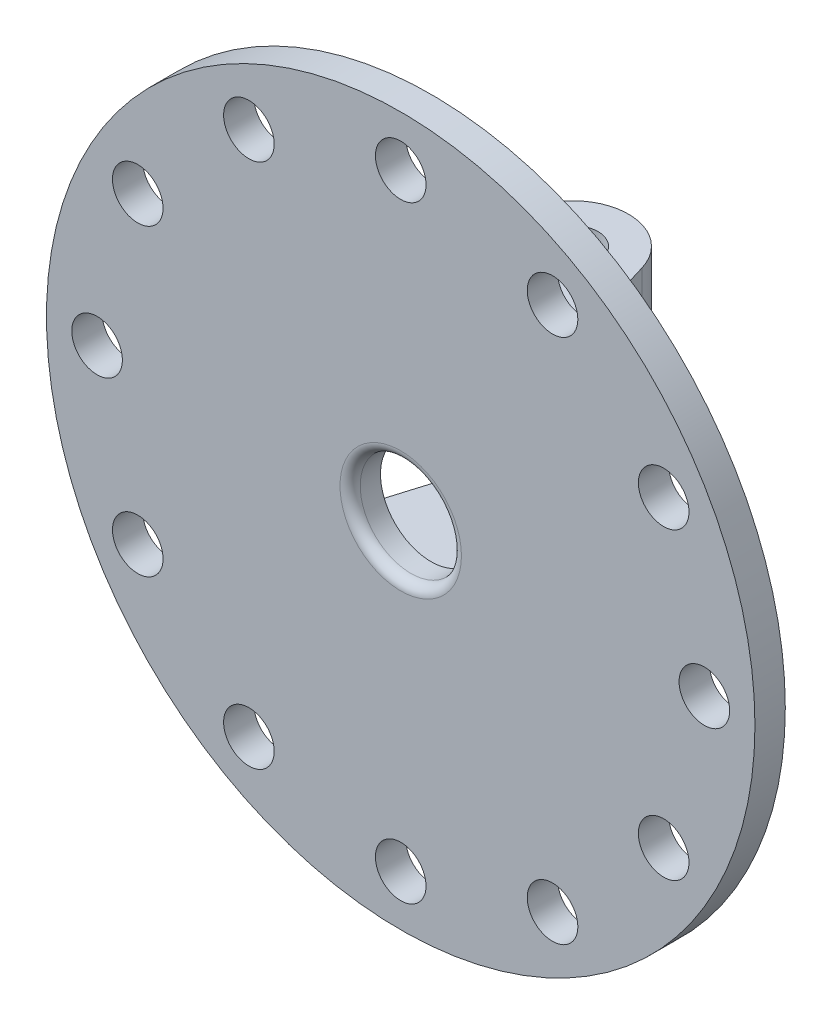
ISO-10303-21;
HEADER;
FILE_DESCRIPTION(('STEP AP214'),'2;1');
FILE_NAME('part.step','',(''),(''),'','','');
FILE_SCHEMA(('AUTOMOTIVE_DESIGN { 1 0 10303 214 1 1 1 1 }'));
ENDSEC;
DATA;
#1=APPLICATION_CONTEXT('core data for automotive mechanical design processes');
#2=APPLICATION_PROTOCOL_DEFINITION('international standard','automotive_design',2000,#1);
#3=PRODUCT_CONTEXT('',#1,'mechanical');
#4=PRODUCT('Part','Part','',(#3));
#5=PRODUCT_RELATED_PRODUCT_CATEGORY('part','',(#4));
#6=PRODUCT_DEFINITION_FORMATION('','',#4);
#7=PRODUCT_DEFINITION_CONTEXT('part definition',#1,'design');
#8=PRODUCT_DEFINITION('design','',#6,#7);
#9=PRODUCT_DEFINITION_SHAPE('','',#8);
#10=(LENGTH_UNIT() NAMED_UNIT(*) SI_UNIT(.MILLI.,.METRE.));
#11=(NAMED_UNIT(*) PLANE_ANGLE_UNIT() SI_UNIT($,.RADIAN.));
#12=(NAMED_UNIT(*) SI_UNIT($,.STERADIAN.) SOLID_ANGLE_UNIT());
#13=UNCERTAINTY_MEASURE_WITH_UNIT(LENGTH_MEASURE(1.E-05),#10,'distance_accuracy_value','');
#14=(GEOMETRIC_REPRESENTATION_CONTEXT(3) GLOBAL_UNCERTAINTY_ASSIGNED_CONTEXT((#13)) GLOBAL_UNIT_ASSIGNED_CONTEXT((#10,
#11,#12)) REPRESENTATION_CONTEXT('',''));
#15=CARTESIAN_POINT('',(0.,0.,0.));
#16=DIRECTION('',(0.,0.,1.));
#17=DIRECTION('',(1.,0.,0.));
#18=AXIS2_PLACEMENT_3D('',#15,#16,#17);
#19=CARTESIAN_POINT('',(-10.,15.,0.));
#20=DIRECTION('',(0.95684380208316,0.,0.290602715773686));
#21=DIRECTION('',(0.290602715773686,0.,-0.95684380208316));
#22=AXIS2_PLACEMENT_3D('',#19,#20,#21);
#23=PLANE('',#22);
#24=DIRECTION('',(0.,-1.,0.));
#25=VECTOR('',#24,1.);
#26=CARTESIAN_POINT('',(-10.,15.,0.));
#27=LINE('',#26,#25);
#28=CARTESIAN_POINT('',(-10.,-6.,0.));
#29=VERTEX_POINT('',#28);
#30=CARTESIAN_POINT('',(-10.,-15.,0.));
#31=VERTEX_POINT('',#30);
#32=EDGE_CURVE('E238',#29,#31,#27,.T.);
#33=ORIENTED_EDGE('',*,*,#32,.F.);
#34=DIRECTION('',(0.290602715773686,0.,-0.95684380208316));
#35=VECTOR('',#34,1.);
#36=CARTESIAN_POINT('',(-10.,-6.,0.));
#37=LINE('',#36,#35);
#38=CARTESIAN_POINT('',(-5.26264091145738,-6.,-15.5983149367553));
#39=VERTEX_POINT('',#38);
#40=EDGE_CURVE('E217',#29,#39,#37,.T.);
#41=ORIENTED_EDGE('',*,*,#40,.T.);
#42=DIRECTION('',(0.,-1.,0.));
#43=VECTOR('',#42,1.);
#44=CARTESIAN_POINT('',(-5.26264091145738,15.,-15.5983149367553));
#45=LINE('',#44,#43);
#46=CARTESIAN_POINT('',(-5.26264091145738,-15.,-15.5983149367553));
#47=VERTEX_POINT('',#46);
#48=EDGE_CURVE('E242',#39,#47,#45,.T.);
#49=ORIENTED_EDGE('',*,*,#48,.T.);
#50=DIRECTION('',(-0.290602715773686,0.,0.95684380208316));
#51=VECTOR('',#50,1.);
#52=CARTESIAN_POINT('',(-10.,-15.,0.));
#53=LINE('',#52,#51);
#54=EDGE_CURVE('E239',#47,#31,#53,.T.);
#55=ORIENTED_EDGE('',*,*,#54,.T.);
#56=EDGE_LOOP('',(#33,#41,#49,#55));
#57=FACE_BOUND('',#56,.T.);
#58=ADVANCED_FACE('F33',(#57),#23,.F.);
#59=CARTESIAN_POINT('',(10.,15.,0.));
#60=DIRECTION('',(-0.95684380208316,0.,0.290602715773686));
#61=DIRECTION('',(0.290602715773686,0.,0.95684380208316));
#62=AXIS2_PLACEMENT_3D('',#59,#60,#61);
#63=PLANE('',#62);
#64=DIRECTION('',(0.,-1.,0.));
#65=VECTOR('',#64,1.);
#66=CARTESIAN_POINT('',(5.26264091145739,15.,-15.5983149367553));
#67=LINE('',#66,#65);
#68=CARTESIAN_POINT('',(5.26264091145739,-6.,-15.5983149367553));
#69=VERTEX_POINT('',#68);
#70=CARTESIAN_POINT('',(5.26264091145739,-15.,-15.5983149367553));
#71=VERTEX_POINT('',#70);
#72=EDGE_CURVE('E228',#69,#71,#67,.T.);
#73=ORIENTED_EDGE('',*,*,#72,.F.);
#74=DIRECTION('',(0.290602715773686,0.,0.95684380208316));
#75=VECTOR('',#74,1.);
#76=CARTESIAN_POINT('',(10.,-6.,0.));
#77=LINE('',#76,#75);
#78=CARTESIAN_POINT('',(10.,-6.,0.));
#79=VERTEX_POINT('',#78);
#80=EDGE_CURVE('E237',#69,#79,#77,.T.);
#81=ORIENTED_EDGE('',*,*,#80,.T.);
#82=DIRECTION('',(0.,-1.,0.));
#83=VECTOR('',#82,1.);
#84=CARTESIAN_POINT('',(10.,15.,0.));
#85=LINE('',#84,#83);
#86=CARTESIAN_POINT('',(10.,-15.,0.));
#87=VERTEX_POINT('',#86);
#88=EDGE_CURVE('E233',#79,#87,#85,.T.);
#89=ORIENTED_EDGE('',*,*,#88,.T.);
#90=DIRECTION('',(-0.290602715773686,0.,-0.95684380208316));
#91=VECTOR('',#90,1.);
#92=CARTESIAN_POINT('',(10.,-15.,0.));
#93=LINE('',#92,#91);
#94=EDGE_CURVE('E229',#87,#71,#93,.T.);
#95=ORIENTED_EDGE('',*,*,#94,.T.);
#96=EDGE_LOOP('',(#73,#81,#89,#95));
#97=FACE_BOUND('',#96,.T.);
#98=ADVANCED_FACE('F273',(#97),#63,.F.);
#99=CARTESIAN_POINT('',(0.,15.,-14.));
#100=DIRECTION('',(0.,-1.,0.));
#101=DIRECTION('',(0.,0.,-1.));
#102=AXIS2_PLACEMENT_3D('',#99,#100,#101);
#103=CYLINDRICAL_SURFACE('',#102,5.5);
#104=ORIENTED_EDGE('',*,*,#48,.F.);
#105=CARTESIAN_POINT('',(0.,-6.,-14.));
#106=DIRECTION('',(0.,-1.,0.));
#107=DIRECTION('',(0.,0.,-1.));
#108=AXIS2_PLACEMENT_3D('',#105,#106,#107);
#109=CIRCLE('',#108,5.5);
#110=EDGE_CURVE('E232',#39,#69,#109,.T.);
#111=ORIENTED_EDGE('',*,*,#110,.T.);
#112=ORIENTED_EDGE('',*,*,#72,.T.);
#113=CARTESIAN_POINT('',(0.,-15.,-14.));
#114=DIRECTION('',(0.,1.,0.));
#115=DIRECTION('',(0.,0.,1.));
#116=AXIS2_PLACEMENT_3D('',#113,#114,#115);
#117=CIRCLE('',#116,5.5);
#118=EDGE_CURVE('E225',#71,#47,#117,.T.);
#119=ORIENTED_EDGE('',*,*,#118,.T.);
#120=EDGE_LOOP('',(#104,#111,#112,#119));
#121=FACE_BOUND('',#120,.T.);
#122=ADVANCED_FACE('F279',(#121),#103,.T.);
#123=CARTESIAN_POINT('',(0.,15.,-14.));
#124=DIRECTION('',(0.,-1.,0.));
#125=DIRECTION('',(0.,0.,-1.));
#126=AXIS2_PLACEMENT_3D('',#123,#124,#125);
#127=CYLINDRICAL_SURFACE('',#126,2.5);
#128=CARTESIAN_POINT('',(0.,-6.,-14.));
#129=DIRECTION('',(0.,-1.,0.));
#130=DIRECTION('',(0.,0.,-1.));
#131=AXIS2_PLACEMENT_3D('',#128,#129,#130);
#132=CIRCLE('',#131,2.5);
#133=CARTESIAN_POINT('',(0.,-6.,-16.5));
#134=VERTEX_POINT('',#133);
#135=EDGE_CURVE('E220',#134,#134,#132,.T.);
#136=ORIENTED_EDGE('',*,*,#135,.F.);
#137=EDGE_LOOP('',(#136));
#138=FACE_BOUND('',#137,.T.);
#139=CARTESIAN_POINT('',(0.,-15.,-14.));
#140=DIRECTION('',(0.,1.,0.));
#141=DIRECTION('',(0.,0.,1.));
#142=AXIS2_PLACEMENT_3D('',#139,#140,#141);
#143=CIRCLE('',#142,2.5);
#144=CARTESIAN_POINT('',(0.,-15.,-11.5));
#145=VERTEX_POINT('',#144);
#146=EDGE_CURVE('E224',#145,#145,#143,.T.);
#147=ORIENTED_EDGE('',*,*,#146,.F.);
#148=EDGE_LOOP('',(#147));
#149=FACE_BOUND('',#148,.T.);
#150=ADVANCED_FACE('F284',(#138,#149),#127,.F.);
#151=CARTESIAN_POINT('',(0.,-15.,-14.));
#152=DIRECTION('',(0.,1.,0.));
#153=DIRECTION('',(0.,0.,1.));
#154=AXIS2_PLACEMENT_3D('',#151,#152,#153);
#155=PLANE('',#154);
#156=ORIENTED_EDGE('',*,*,#54,.F.);
#157=ORIENTED_EDGE('',*,*,#118,.F.);
#158=ORIENTED_EDGE('',*,*,#94,.F.);
#159=DIRECTION('',(1.,0.,0.));
#160=VECTOR('',#159,1.);
#161=CARTESIAN_POINT('',(-10.,-15.,0.));
#162=LINE('',#161,#160);
#163=EDGE_CURVE('E234',#31,#87,#162,.T.);
#164=ORIENTED_EDGE('',*,*,#163,.F.);
#165=EDGE_LOOP('',(#156,#157,#158,#164));
#166=FACE_BOUND('',#165,.T.);
#167=ORIENTED_EDGE('',*,*,#146,.T.);
#168=EDGE_LOOP('',(#167));
#169=FACE_BOUND('',#168,.T.);
#170=ADVANCED_FACE('F286',(#166,#169),#155,.F.);
#171=CARTESIAN_POINT('',(-15.,-6.,0.));
#172=DIRECTION('',(0.,-1.,0.));
#173=DIRECTION('',(0.,0.,-1.));
#174=AXIS2_PLACEMENT_3D('',#171,#172,#173);
#175=PLANE('',#174);
#176=ORIENTED_EDGE('',*,*,#135,.T.);
#177=EDGE_LOOP('',(#176));
#178=FACE_BOUND('',#177,.T.);
#179=DIRECTION('',(1.,0.,0.));
#180=VECTOR('',#179,1.);
#181=CARTESIAN_POINT('',(-15.,-6.,0.));
#182=LINE('',#181,#180);
#183=EDGE_CURVE('E223',#29,#79,#182,.T.);
#184=ORIENTED_EDGE('',*,*,#183,.T.);
#185=ORIENTED_EDGE('',*,*,#80,.F.);
#186=ORIENTED_EDGE('',*,*,#110,.F.);
#187=ORIENTED_EDGE('',*,*,#40,.F.);
#188=EDGE_LOOP('',(#184,#185,#186,#187));
#189=FACE_BOUND('',#188,.T.);
#190=ADVANCED_FACE('F292',(#178,#189),#175,.F.);
#191=CARTESIAN_POINT('',(0.,0.,3.));
#192=DIRECTION('',(0.,0.,1.));
#193=DIRECTION('',(1.,0.,0.));
#194=AXIS2_PLACEMENT_3D('',#191,#192,#193);
#195=PLANE('',#194);
#196=CARTESIAN_POINT('',(0.,0.,3.));
#197=DIRECTION('',(0.,0.,1.));
#198=DIRECTION('',(1.,0.,0.));
#199=AXIS2_PLACEMENT_3D('',#196,#197,#198);
#200=CIRCLE('',#199,6.);
#201=CARTESIAN_POINT('',(6.,0.,3.));
#202=VERTEX_POINT('',#201);
#203=EDGE_CURVE('E11',#202,#202,#200,.F.);
#204=ORIENTED_EDGE('',*,*,#203,.T.);
#205=EDGE_LOOP('',(#204));
#206=FACE_BOUND('',#205,.T.);
#207=CARTESIAN_POINT('',(-25.9807621135338,15.000000000002,3.));
#208=DIRECTION('',(0.,0.,1.));
#209=DIRECTION('',(1.,0.,0.));
#210=AXIS2_PLACEMENT_3D('',#207,#208,#209);
#211=CIRCLE('',#210,2.5);
#212=CARTESIAN_POINT('',(-23.4807621135338,15.000000000002,3.));
#213=VERTEX_POINT('',#212);
#214=EDGE_CURVE('E145',#213,#213,#211,.T.);
#215=ORIENTED_EDGE('',*,*,#214,.F.);
#216=EDGE_LOOP('',(#215));
#217=FACE_BOUND('',#216,.T.);
#218=CARTESIAN_POINT('',(-25.9807621135332,-15.0000000000001,3.));
#219=DIRECTION('',(0.,0.,1.));
#220=DIRECTION('',(1.,0.,0.));
#221=AXIS2_PLACEMENT_3D('',#218,#219,#220);
#222=CIRCLE('',#221,2.5);
#223=CARTESIAN_POINT('',(-23.4807621135332,-15.0000000000001,3.));
#224=VERTEX_POINT('',#223);
#225=EDGE_CURVE('E157',#224,#224,#222,.T.);
#226=ORIENTED_EDGE('',*,*,#225,.F.);
#227=EDGE_LOOP('',(#226));
#228=FACE_BOUND('',#227,.T.);
#229=CARTESIAN_POINT('',(0.,-30.0000000000001,3.));
#230=DIRECTION('',(0.,0.,1.));
#231=DIRECTION('',(1.,0.,0.));
#232=AXIS2_PLACEMENT_3D('',#229,#230,#231);
#233=CIRCLE('',#232,2.5);
#234=CARTESIAN_POINT('',(2.49999999999997,-30.0000000000001,3.));
#235=VERTEX_POINT('',#234);
#236=EDGE_CURVE('E169',#235,#235,#233,.T.);
#237=ORIENTED_EDGE('',*,*,#236,.F.);
#238=EDGE_LOOP('',(#237));
#239=FACE_BOUND('',#238,.T.);
#240=CARTESIAN_POINT('',(25.9807621135332,-15.0000000000001,3.));
#241=DIRECTION('',(0.,0.,1.));
#242=DIRECTION('',(1.,0.,0.));
#243=AXIS2_PLACEMENT_3D('',#240,#241,#242);
#244=CIRCLE('',#243,2.5);
#245=CARTESIAN_POINT('',(28.4807621135332,-15.0000000000001,3.));
#246=VERTEX_POINT('',#245);
#247=EDGE_CURVE('E181',#246,#246,#244,.T.);
#248=ORIENTED_EDGE('',*,*,#247,.F.);
#249=EDGE_LOOP('',(#248));
#250=FACE_BOUND('',#249,.T.);
#251=CARTESIAN_POINT('',(25.9807621135317,14.9999999999984,3.));
#252=DIRECTION('',(0.,0.,1.));
#253=DIRECTION('',(1.,0.,0.));
#254=AXIS2_PLACEMENT_3D('',#251,#252,#253);
#255=CIRCLE('',#254,2.5);
#256=CARTESIAN_POINT('',(28.4807621135317,14.9999999999984,3.));
#257=VERTEX_POINT('',#256);
#258=EDGE_CURVE('E193',#257,#257,#255,.T.);
#259=ORIENTED_EDGE('',*,*,#258,.F.);
#260=EDGE_LOOP('',(#259));
#261=FACE_BOUND('',#260,.T.);
#262=CARTESIAN_POINT('',(0.,30.,3.));
#263=DIRECTION('',(0.,0.,1.));
#264=DIRECTION('',(1.,0.,0.));
#265=AXIS2_PLACEMENT_3D('',#262,#263,#264);
#266=CIRCLE('',#265,2.5);
#267=CARTESIAN_POINT('',(2.5,30.,3.));
#268=VERTEX_POINT('',#267);
#269=EDGE_CURVE('E205',#268,#268,#266,.T.);
#270=ORIENTED_EDGE('',*,*,#269,.F.);
#271=EDGE_LOOP('',(#270));
#272=FACE_BOUND('',#271,.T.);
#273=CARTESIAN_POINT('',(0.,0.,3.));
#274=DIRECTION('',(0.,0.,1.));
#275=DIRECTION('',(1.,0.,0.));
#276=AXIS2_PLACEMENT_3D('',#273,#274,#275);
#277=CIRCLE('',#276,35.);
#278=CARTESIAN_POINT('',(35.,0.,3.));
#279=VERTEX_POINT('',#278);
#280=EDGE_CURVE('E214',#279,#279,#277,.T.);
#281=ORIENTED_EDGE('',*,*,#280,.T.);
#282=EDGE_LOOP('',(#281));
#283=FACE_BOUND('',#282,.T.);
#284=CARTESIAN_POINT('',(15.,25.9807621135331,3.));
#285=DIRECTION('',(0.,0.,1.));
#286=DIRECTION('',(1.,0.,0.));
#287=AXIS2_PLACEMENT_3D('',#284,#285,#286);
#288=CIRCLE('',#287,2.5);
#289=CARTESIAN_POINT('',(17.5,25.9807621135331,3.));
#290=VERTEX_POINT('',#289);
#291=EDGE_CURVE('E199',#290,#290,#288,.T.);
#292=ORIENTED_EDGE('',*,*,#291,.F.);
#293=EDGE_LOOP('',(#292));
#294=FACE_BOUND('',#293,.T.);
#295=CARTESIAN_POINT('',(30.,0.,3.));
#296=DIRECTION('',(0.,0.,1.));
#297=DIRECTION('',(1.,0.,0.));
#298=AXIS2_PLACEMENT_3D('',#295,#296,#297);
#299=CIRCLE('',#298,2.5);
#300=CARTESIAN_POINT('',(32.5,0.,3.));
#301=VERTEX_POINT('',#300);
#302=EDGE_CURVE('E187',#301,#301,#299,.T.);
#303=ORIENTED_EDGE('',*,*,#302,.F.);
#304=EDGE_LOOP('',(#303));
#305=FACE_BOUND('',#304,.T.);
#306=CARTESIAN_POINT('',(15.,-25.9807621135333,3.));
#307=DIRECTION('',(0.,0.,1.));
#308=DIRECTION('',(1.,0.,0.));
#309=AXIS2_PLACEMENT_3D('',#306,#307,#308);
#310=CIRCLE('',#309,2.5);
#311=CARTESIAN_POINT('',(17.5,-25.9807621135333,3.));
#312=VERTEX_POINT('',#311);
#313=EDGE_CURVE('E175',#312,#312,#310,.T.);
#314=ORIENTED_EDGE('',*,*,#313,.F.);
#315=EDGE_LOOP('',(#314));
#316=FACE_BOUND('',#315,.T.);
#317=CARTESIAN_POINT('',(-15.0000000000001,-25.9807621135333,3.));
#318=DIRECTION('',(0.,0.,1.));
#319=DIRECTION('',(1.,0.,0.));
#320=AXIS2_PLACEMENT_3D('',#317,#318,#319);
#321=CIRCLE('',#320,2.5);
#322=CARTESIAN_POINT('',(-12.5000000000001,-25.9807621135333,3.));
#323=VERTEX_POINT('',#322);
#324=EDGE_CURVE('E163',#323,#323,#321,.T.);
#325=ORIENTED_EDGE('',*,*,#324,.F.);
#326=EDGE_LOOP('',(#325));
#327=FACE_BOUND('',#326,.T.);
#328=CARTESIAN_POINT('',(-30.0000000000001,0.,3.));
#329=DIRECTION('',(0.,0.,1.));
#330=DIRECTION('',(1.,0.,0.));
#331=AXIS2_PLACEMENT_3D('',#328,#329,#330);
#332=CIRCLE('',#331,2.5);
#333=CARTESIAN_POINT('',(-27.5000000000001,0.,3.));
#334=VERTEX_POINT('',#333);
#335=EDGE_CURVE('E151',#334,#334,#332,.T.);
#336=ORIENTED_EDGE('',*,*,#335,.F.);
#337=EDGE_LOOP('',(#336));
#338=FACE_BOUND('',#337,.T.);
#339=CARTESIAN_POINT('',(-15.,25.9807621135332,3.));
#340=DIRECTION('',(0.,0.,1.));
#341=DIRECTION('',(1.,0.,0.));
#342=AXIS2_PLACEMENT_3D('',#339,#340,#341);
#343=CIRCLE('',#342,2.5);
#344=CARTESIAN_POINT('',(-12.5,25.9807621135332,3.));
#345=VERTEX_POINT('',#344);
#346=EDGE_CURVE('E139',#345,#345,#343,.T.);
#347=ORIENTED_EDGE('',*,*,#346,.F.);
#348=EDGE_LOOP('',(#347));
#349=FACE_BOUND('',#348,.T.);
#350=ADVANCED_FACE('F303',(#206,#217,#228,#239,#250,#261,#272,#283,#294,#305,#316,#327,#338,
#349),#195,.T.);
#351=CARTESIAN_POINT('',(0.,0.,0.));
#352=DIRECTION('',(0.,0.,1.));
#353=DIRECTION('',(1.,0.,0.));
#354=AXIS2_PLACEMENT_3D('',#351,#352,#353);
#355=PLANE('',#354);
#356=DIRECTION('',(0.,-1.,0.));
#357=VECTOR('',#356,1.);
#358=CARTESIAN_POINT('',(10.,15.,0.));
#359=LINE('',#358,#357);
#360=CARTESIAN_POINT('',(10.,15.,0.));
#361=VERTEX_POINT('',#360);
#362=CARTESIAN_POINT('',(10.,6.,0.));
#363=VERTEX_POINT('',#362);
#364=EDGE_CURVE('E48',#361,#363,#359,.T.);
#365=ORIENTED_EDGE('',*,*,#364,.F.);
#366=DIRECTION('',(1.,0.,0.));
#367=VECTOR('',#366,1.);
#368=CARTESIAN_POINT('',(-10.,15.,0.));
#369=LINE('',#368,#367);
#370=CARTESIAN_POINT('',(-10.,15.,0.));
#371=VERTEX_POINT('',#370);
#372=EDGE_CURVE('E52',#371,#361,#369,.T.);
#373=ORIENTED_EDGE('',*,*,#372,.F.);
#374=DIRECTION('',(0.,-1.,0.));
#375=VECTOR('',#374,1.);
#376=CARTESIAN_POINT('',(-10.,15.,0.));
#377=LINE('',#376,#375);
#378=CARTESIAN_POINT('',(-10.,6.,0.));
#379=VERTEX_POINT('',#378);
#380=EDGE_CURVE('E94',#371,#379,#377,.T.);
#381=ORIENTED_EDGE('',*,*,#380,.T.);
#382=DIRECTION('',(1.,0.,0.));
#383=VECTOR('',#382,1.);
#384=CARTESIAN_POINT('',(-15.,6.,0.));
#385=LINE('',#384,#383);
#386=EDGE_CURVE('E98',#379,#363,#385,.T.);
#387=ORIENTED_EDGE('',*,*,#386,.T.);
#388=EDGE_LOOP('',(#365,#373,#381,#387));
#389=FACE_BOUND('',#388,.T.);
#390=ORIENTED_EDGE('',*,*,#88,.F.);
#391=ORIENTED_EDGE('',*,*,#183,.F.);
#392=ORIENTED_EDGE('',*,*,#32,.T.);
#393=ORIENTED_EDGE('',*,*,#163,.T.);
#394=EDGE_LOOP('',(#390,#391,#392,#393));
#395=FACE_BOUND('',#394,.T.);
#396=CARTESIAN_POINT('',(0.,0.,0.));
#397=DIRECTION('',(0.,0.,1.));
#398=DIRECTION('',(1.,0.,0.));
#399=AXIS2_PLACEMENT_3D('',#396,#397,#398);
#400=CIRCLE('',#399,35.);
#401=CARTESIAN_POINT('',(35.,0.,0.));
#402=VERTEX_POINT('',#401);
#403=EDGE_CURVE('E213',#402,#402,#400,.T.);
#404=ORIENTED_EDGE('',*,*,#403,.F.);
#405=EDGE_LOOP('',(#404));
#406=FACE_BOUND('',#405,.T.);
#407=CARTESIAN_POINT('',(0.,0.,0.));
#408=DIRECTION('',(0.,0.,1.));
#409=DIRECTION('',(1.,0.,0.));
#410=AXIS2_PLACEMENT_3D('',#407,#408,#409);
#411=CIRCLE('',#410,5.);
#412=CARTESIAN_POINT('',(5.,0.,0.));
#413=VERTEX_POINT('',#412);
#414=EDGE_CURVE('E208',#413,#413,#411,.T.);
#415=ORIENTED_EDGE('',*,*,#414,.T.);
#416=EDGE_LOOP('',(#415));
#417=FACE_BOUND('',#416,.T.);
#418=CARTESIAN_POINT('',(0.,30.,0.));
#419=DIRECTION('',(0.,0.,1.));
#420=DIRECTION('',(1.,0.,0.));
#421=AXIS2_PLACEMENT_3D('',#418,#419,#420);
#422=CIRCLE('',#421,2.5);
#423=CARTESIAN_POINT('',(2.5,30.,0.));
#424=VERTEX_POINT('',#423);
#425=EDGE_CURVE('E202',#424,#424,#422,.T.);
#426=ORIENTED_EDGE('',*,*,#425,.T.);
#427=EDGE_LOOP('',(#426));
#428=FACE_BOUND('',#427,.T.);
#429=CARTESIAN_POINT('',(15.,25.9807621135331,0.));
#430=DIRECTION('',(0.,0.,1.));
#431=DIRECTION('',(1.,0.,0.));
#432=AXIS2_PLACEMENT_3D('',#429,#430,#431);
#433=CIRCLE('',#432,2.5);
#434=CARTESIAN_POINT('',(17.5,25.9807621135331,0.));
#435=VERTEX_POINT('',#434);
#436=EDGE_CURVE('E196',#435,#435,#433,.T.);
#437=ORIENTED_EDGE('',*,*,#436,.T.);
#438=EDGE_LOOP('',(#437));
#439=FACE_BOUND('',#438,.T.);
#440=CARTESIAN_POINT('',(25.9807621135317,14.9999999999984,0.));
#441=DIRECTION('',(0.,0.,1.));
#442=DIRECTION('',(1.,0.,0.));
#443=AXIS2_PLACEMENT_3D('',#440,#441,#442);
#444=CIRCLE('',#443,2.5);
#445=CARTESIAN_POINT('',(28.4807621135317,14.9999999999984,0.));
#446=VERTEX_POINT('',#445);
#447=EDGE_CURVE('E190',#446,#446,#444,.T.);
#448=ORIENTED_EDGE('',*,*,#447,.T.);
#449=EDGE_LOOP('',(#448));
#450=FACE_BOUND('',#449,.T.);
#451=CARTESIAN_POINT('',(30.,0.,0.));
#452=DIRECTION('',(0.,0.,1.));
#453=DIRECTION('',(1.,0.,0.));
#454=AXIS2_PLACEMENT_3D('',#451,#452,#453);
#455=CIRCLE('',#454,2.5);
#456=CARTESIAN_POINT('',(32.5,0.,0.));
#457=VERTEX_POINT('',#456);
#458=EDGE_CURVE('E184',#457,#457,#455,.T.);
#459=ORIENTED_EDGE('',*,*,#458,.T.);
#460=EDGE_LOOP('',(#459));
#461=FACE_BOUND('',#460,.T.);
#462=CARTESIAN_POINT('',(25.9807621135332,-15.0000000000001,0.));
#463=DIRECTION('',(0.,0.,1.));
#464=DIRECTION('',(1.,0.,0.));
#465=AXIS2_PLACEMENT_3D('',#462,#463,#464);
#466=CIRCLE('',#465,2.5);
#467=CARTESIAN_POINT('',(28.4807621135332,-15.0000000000001,0.));
#468=VERTEX_POINT('',#467);
#469=EDGE_CURVE('E178',#468,#468,#466,.T.);
#470=ORIENTED_EDGE('',*,*,#469,.T.);
#471=EDGE_LOOP('',(#470));
#472=FACE_BOUND('',#471,.T.);
#473=CARTESIAN_POINT('',(15.,-25.9807621135333,0.));
#474=DIRECTION('',(0.,0.,1.));
#475=DIRECTION('',(1.,0.,0.));
#476=AXIS2_PLACEMENT_3D('',#473,#474,#475);
#477=CIRCLE('',#476,2.5);
#478=CARTESIAN_POINT('',(17.5,-25.9807621135333,0.));
#479=VERTEX_POINT('',#478);
#480=EDGE_CURVE('E172',#479,#479,#477,.T.);
#481=ORIENTED_EDGE('',*,*,#480,.T.);
#482=EDGE_LOOP('',(#481));
#483=FACE_BOUND('',#482,.T.);
#484=CARTESIAN_POINT('',(0.,-30.0000000000001,0.));
#485=DIRECTION('',(0.,0.,1.));
#486=DIRECTION('',(1.,0.,0.));
#487=AXIS2_PLACEMENT_3D('',#484,#485,#486);
#488=CIRCLE('',#487,2.5);
#489=CARTESIAN_POINT('',(2.49999999999997,-30.0000000000001,0.));
#490=VERTEX_POINT('',#489);
#491=EDGE_CURVE('E166',#490,#490,#488,.T.);
#492=ORIENTED_EDGE('',*,*,#491,.T.);
#493=EDGE_LOOP('',(#492));
#494=FACE_BOUND('',#493,.T.);
#495=CARTESIAN_POINT('',(-15.0000000000001,-25.9807621135333,0.));
#496=DIRECTION('',(0.,0.,1.));
#497=DIRECTION('',(1.,0.,0.));
#498=AXIS2_PLACEMENT_3D('',#495,#496,#497);
#499=CIRCLE('',#498,2.5);
#500=CARTESIAN_POINT('',(-12.5000000000001,-25.9807621135333,0.));
#501=VERTEX_POINT('',#500);
#502=EDGE_CURVE('E160',#501,#501,#499,.T.);
#503=ORIENTED_EDGE('',*,*,#502,.T.);
#504=EDGE_LOOP('',(#503));
#505=FACE_BOUND('',#504,.T.);
#506=CARTESIAN_POINT('',(-25.9807621135332,-15.0000000000001,0.));
#507=DIRECTION('',(0.,0.,1.));
#508=DIRECTION('',(1.,0.,0.));
#509=AXIS2_PLACEMENT_3D('',#506,#507,#508);
#510=CIRCLE('',#509,2.5);
#511=CARTESIAN_POINT('',(-23.4807621135332,-15.0000000000001,0.));
#512=VERTEX_POINT('',#511);
#513=EDGE_CURVE('E154',#512,#512,#510,.T.);
#514=ORIENTED_EDGE('',*,*,#513,.T.);
#515=EDGE_LOOP('',(#514));
#516=FACE_BOUND('',#515,.T.);
#517=CARTESIAN_POINT('',(-30.0000000000001,0.,0.));
#518=DIRECTION('',(0.,0.,1.));
#519=DIRECTION('',(1.,0.,0.));
#520=AXIS2_PLACEMENT_3D('',#517,#518,#519);
#521=CIRCLE('',#520,2.5);
#522=CARTESIAN_POINT('',(-27.5000000000001,0.,0.));
#523=VERTEX_POINT('',#522);
#524=EDGE_CURVE('E148',#523,#523,#521,.T.);
#525=ORIENTED_EDGE('',*,*,#524,.T.);
#526=EDGE_LOOP('',(#525));
#527=FACE_BOUND('',#526,.T.);
#528=CARTESIAN_POINT('',(-25.9807621135338,15.000000000002,0.));
#529=DIRECTION('',(0.,0.,1.));
#530=DIRECTION('',(1.,0.,0.));
#531=AXIS2_PLACEMENT_3D('',#528,#529,#530);
#532=CIRCLE('',#531,2.5);
#533=CARTESIAN_POINT('',(-23.4807621135338,15.000000000002,0.));
#534=VERTEX_POINT('',#533);
#535=EDGE_CURVE('E142',#534,#534,#532,.T.);
#536=ORIENTED_EDGE('',*,*,#535,.T.);
#537=EDGE_LOOP('',(#536));
#538=FACE_BOUND('',#537,.T.);
#539=CARTESIAN_POINT('',(-15.,25.9807621135332,0.));
#540=DIRECTION('',(0.,0.,1.));
#541=DIRECTION('',(1.,0.,0.));
#542=AXIS2_PLACEMENT_3D('',#539,#540,#541);
#543=CIRCLE('',#542,2.5);
#544=CARTESIAN_POINT('',(-12.5,25.9807621135332,0.));
#545=VERTEX_POINT('',#544);
#546=EDGE_CURVE('E103',#545,#545,#543,.T.);
#547=ORIENTED_EDGE('',*,*,#546,.T.);
#548=EDGE_LOOP('',(#547));
#549=FACE_BOUND('',#548,.T.);
#550=ADVANCED_FACE('F96',(#389,#395,#406,#417,#428,#439,#450,#461,#472,#483,#494,#505,#516,#527,
#538,#549),#355,.F.);
#551=CARTESIAN_POINT('',(0.,0.,3.));
#552=DIRECTION('',(0.,0.,-1.));
#553=DIRECTION('',(-1.,0.,0.));
#554=AXIS2_PLACEMENT_3D('',#551,#552,#553);
#555=CYLINDRICAL_SURFACE('',#554,35.);
#556=ORIENTED_EDGE('',*,*,#280,.F.);
#557=EDGE_LOOP('',(#556));
#558=FACE_BOUND('',#557,.T.);
#559=ORIENTED_EDGE('',*,*,#403,.T.);
#560=EDGE_LOOP('',(#559));
#561=FACE_BOUND('',#560,.T.);
#562=ADVANCED_FACE('F313',(#558,#561),#555,.T.);
#563=CARTESIAN_POINT('',(0.,0.,3.));
#564=DIRECTION('',(0.,0.,-1.));
#565=DIRECTION('',(-1.,0.,0.));
#566=AXIS2_PLACEMENT_3D('',#563,#564,#565);
#567=CYLINDRICAL_SURFACE('',#566,5.);
#568=CARTESIAN_POINT('',(0.,0.,2.));
#569=DIRECTION('',(0.,0.,1.));
#570=DIRECTION('',(1.,0.,0.));
#571=AXIS2_PLACEMENT_3D('',#568,#569,#570);
#572=CIRCLE('',#571,5.);
#573=CARTESIAN_POINT('',(5.,0.,2.));
#574=VERTEX_POINT('',#573);
#575=EDGE_CURVE('E41',#574,#574,#572,.T.);
#576=ORIENTED_EDGE('',*,*,#575,.T.);
#577=EDGE_LOOP('',(#576));
#578=FACE_BOUND('',#577,.T.);
#579=ORIENTED_EDGE('',*,*,#414,.F.);
#580=EDGE_LOOP('',(#579));
#581=FACE_BOUND('',#580,.T.);
#582=ADVANCED_FACE('F260',(#578,#581),#567,.F.);
#583=CARTESIAN_POINT('',(0.,30.,3.));
#584=DIRECTION('',(0.,0.,-1.));
#585=DIRECTION('',(-1.,0.,0.));
#586=AXIS2_PLACEMENT_3D('',#583,#584,#585);
#587=CYLINDRICAL_SURFACE('',#586,2.5);
#588=ORIENTED_EDGE('',*,*,#269,.T.);
#589=EDGE_LOOP('',(#588));
#590=FACE_BOUND('',#589,.T.);
#591=ORIENTED_EDGE('',*,*,#425,.F.);
#592=EDGE_LOOP('',(#591));
#593=FACE_BOUND('',#592,.T.);
#594=ADVANCED_FACE('F396',(#590,#593),#587,.F.);
#595=CARTESIAN_POINT('',(15.,25.9807621135331,3.));
#596=DIRECTION('',(0.,0.,-1.));
#597=DIRECTION('',(-1.,0.,0.));
#598=AXIS2_PLACEMENT_3D('',#595,#596,#597);
#599=CYLINDRICAL_SURFACE('',#598,2.5);
#600=ORIENTED_EDGE('',*,*,#291,.T.);
#601=EDGE_LOOP('',(#600));
#602=FACE_BOUND('',#601,.T.);
#603=ORIENTED_EDGE('',*,*,#436,.F.);
#604=EDGE_LOOP('',(#603));
#605=FACE_BOUND('',#604,.T.);
#606=ADVANCED_FACE('F392',(#602,#605),#599,.F.);
#607=CARTESIAN_POINT('',(25.9807621135317,14.9999999999984,3.));
#608=DIRECTION('',(0.,0.,-1.));
#609=DIRECTION('',(-1.,0.,0.));
#610=AXIS2_PLACEMENT_3D('',#607,#608,#609);
#611=CYLINDRICAL_SURFACE('',#610,2.5);
#612=ORIENTED_EDGE('',*,*,#258,.T.);
#613=EDGE_LOOP('',(#612));
#614=FACE_BOUND('',#613,.T.);
#615=ORIENTED_EDGE('',*,*,#447,.F.);
#616=EDGE_LOOP('',(#615));
#617=FACE_BOUND('',#616,.T.);
#618=ADVANCED_FACE('F388',(#614,#617),#611,.F.);
#619=CARTESIAN_POINT('',(30.,0.,3.));
#620=DIRECTION('',(0.,0.,-1.));
#621=DIRECTION('',(-1.,0.,0.));
#622=AXIS2_PLACEMENT_3D('',#619,#620,#621);
#623=CYLINDRICAL_SURFACE('',#622,2.5);
#624=ORIENTED_EDGE('',*,*,#302,.T.);
#625=EDGE_LOOP('',(#624));
#626=FACE_BOUND('',#625,.T.);
#627=ORIENTED_EDGE('',*,*,#458,.F.);
#628=EDGE_LOOP('',(#627));
#629=FACE_BOUND('',#628,.T.);
#630=ADVANCED_FACE('F384',(#626,#629),#623,.F.);
#631=CARTESIAN_POINT('',(25.9807621135332,-15.0000000000001,3.));
#632=DIRECTION('',(0.,0.,-1.));
#633=DIRECTION('',(-1.,0.,0.));
#634=AXIS2_PLACEMENT_3D('',#631,#632,#633);
#635=CYLINDRICAL_SURFACE('',#634,2.5);
#636=ORIENTED_EDGE('',*,*,#247,.T.);
#637=EDGE_LOOP('',(#636));
#638=FACE_BOUND('',#637,.T.);
#639=ORIENTED_EDGE('',*,*,#469,.F.);
#640=EDGE_LOOP('',(#639));
#641=FACE_BOUND('',#640,.T.);
#642=ADVANCED_FACE('F380',(#638,#641),#635,.F.);
#643=CARTESIAN_POINT('',(15.,-25.9807621135333,3.));
#644=DIRECTION('',(0.,0.,-1.));
#645=DIRECTION('',(-1.,0.,0.));
#646=AXIS2_PLACEMENT_3D('',#643,#644,#645);
#647=CYLINDRICAL_SURFACE('',#646,2.5);
#648=ORIENTED_EDGE('',*,*,#313,.T.);
#649=EDGE_LOOP('',(#648));
#650=FACE_BOUND('',#649,.T.);
#651=ORIENTED_EDGE('',*,*,#480,.F.);
#652=EDGE_LOOP('',(#651));
#653=FACE_BOUND('',#652,.T.);
#654=ADVANCED_FACE('F376',(#650,#653),#647,.F.);
#655=CARTESIAN_POINT('',(0.,-30.0000000000001,3.));
#656=DIRECTION('',(0.,0.,-1.));
#657=DIRECTION('',(-1.,0.,0.));
#658=AXIS2_PLACEMENT_3D('',#655,#656,#657);
#659=CYLINDRICAL_SURFACE('',#658,2.5);
#660=ORIENTED_EDGE('',*,*,#236,.T.);
#661=EDGE_LOOP('',(#660));
#662=FACE_BOUND('',#661,.T.);
#663=ORIENTED_EDGE('',*,*,#491,.F.);
#664=EDGE_LOOP('',(#663));
#665=FACE_BOUND('',#664,.T.);
#666=ADVANCED_FACE('F372',(#662,#665),#659,.F.);
#667=CARTESIAN_POINT('',(-15.0000000000001,-25.9807621135333,3.));
#668=DIRECTION('',(0.,0.,-1.));
#669=DIRECTION('',(-1.,0.,0.));
#670=AXIS2_PLACEMENT_3D('',#667,#668,#669);
#671=CYLINDRICAL_SURFACE('',#670,2.5);
#672=ORIENTED_EDGE('',*,*,#324,.T.);
#673=EDGE_LOOP('',(#672));
#674=FACE_BOUND('',#673,.T.);
#675=ORIENTED_EDGE('',*,*,#502,.F.);
#676=EDGE_LOOP('',(#675));
#677=FACE_BOUND('',#676,.T.);
#678=ADVANCED_FACE('F368',(#674,#677),#671,.F.);
#679=CARTESIAN_POINT('',(-25.9807621135332,-15.0000000000001,3.));
#680=DIRECTION('',(0.,0.,-1.));
#681=DIRECTION('',(-1.,0.,0.));
#682=AXIS2_PLACEMENT_3D('',#679,#680,#681);
#683=CYLINDRICAL_SURFACE('',#682,2.5);
#684=ORIENTED_EDGE('',*,*,#225,.T.);
#685=EDGE_LOOP('',(#684));
#686=FACE_BOUND('',#685,.T.);
#687=ORIENTED_EDGE('',*,*,#513,.F.);
#688=EDGE_LOOP('',(#687));
#689=FACE_BOUND('',#688,.T.);
#690=ADVANCED_FACE('F364',(#686,#689),#683,.F.);
#691=CARTESIAN_POINT('',(-30.0000000000001,0.,3.));
#692=DIRECTION('',(0.,0.,-1.));
#693=DIRECTION('',(-1.,0.,0.));
#694=AXIS2_PLACEMENT_3D('',#691,#692,#693);
#695=CYLINDRICAL_SURFACE('',#694,2.5);
#696=ORIENTED_EDGE('',*,*,#335,.T.);
#697=EDGE_LOOP('',(#696));
#698=FACE_BOUND('',#697,.T.);
#699=ORIENTED_EDGE('',*,*,#524,.F.);
#700=EDGE_LOOP('',(#699));
#701=FACE_BOUND('',#700,.T.);
#702=ADVANCED_FACE('F356',(#698,#701),#695,.F.);
#703=CARTESIAN_POINT('',(-25.9807621135338,15.000000000002,3.));
#704=DIRECTION('',(0.,0.,-1.));
#705=DIRECTION('',(-1.,0.,0.));
#706=AXIS2_PLACEMENT_3D('',#703,#704,#705);
#707=CYLINDRICAL_SURFACE('',#706,2.5);
#708=ORIENTED_EDGE('',*,*,#214,.T.);
#709=EDGE_LOOP('',(#708));
#710=FACE_BOUND('',#709,.T.);
#711=ORIENTED_EDGE('',*,*,#535,.F.);
#712=EDGE_LOOP('',(#711));
#713=FACE_BOUND('',#712,.T.);
#714=ADVANCED_FACE('F346',(#710,#713),#707,.F.);
#715=CARTESIAN_POINT('',(-15.,25.9807621135332,3.));
#716=DIRECTION('',(0.,0.,-1.));
#717=DIRECTION('',(-1.,0.,0.));
#718=AXIS2_PLACEMENT_3D('',#715,#716,#717);
#719=CYLINDRICAL_SURFACE('',#718,2.5);
#720=ORIENTED_EDGE('',*,*,#346,.T.);
#721=EDGE_LOOP('',(#720));
#722=FACE_BOUND('',#721,.T.);
#723=ORIENTED_EDGE('',*,*,#546,.F.);
#724=EDGE_LOOP('',(#723));
#725=FACE_BOUND('',#724,.T.);
#726=ADVANCED_FACE('F343',(#722,#725),#719,.F.);
#727=CARTESIAN_POINT('',(0.,15.,-14.));
#728=DIRECTION('',(0.,-1.,0.));
#729=DIRECTION('',(0.,0.,-1.));
#730=AXIS2_PLACEMENT_3D('',#727,#728,#729);
#731=CYLINDRICAL_SURFACE('',#730,5.5);
#732=DIRECTION('',(0.,-1.,0.));
#733=VECTOR('',#732,1.);
#734=CARTESIAN_POINT('',(5.26264091145739,15.,-15.5983149367553));
#735=LINE('',#734,#733);
#736=CARTESIAN_POINT('',(5.26264091145739,15.,-15.5983149367553));
#737=VERTEX_POINT('',#736);
#738=CARTESIAN_POINT('',(5.26264091145738,6.00000000000001,-15.5983149367553));
#739=VERTEX_POINT('',#738);
#740=EDGE_CURVE('E133',#737,#739,#735,.T.);
#741=ORIENTED_EDGE('',*,*,#740,.T.);
#742=CARTESIAN_POINT('',(0.,6.00000000000001,-14.));
#743=DIRECTION('',(0.,1.,0.));
#744=DIRECTION('',(0.,0.,1.));
#745=AXIS2_PLACEMENT_3D('',#742,#743,#744);
#746=CIRCLE('',#745,5.5);
#747=CARTESIAN_POINT('',(-5.26264091145738,6.00000000000001,-15.5983149367553));
#748=VERTEX_POINT('',#747);
#749=EDGE_CURVE('E122',#739,#748,#746,.T.);
#750=ORIENTED_EDGE('',*,*,#749,.T.);
#751=DIRECTION('',(0.,-1.,0.));
#752=VECTOR('',#751,1.);
#753=CARTESIAN_POINT('',(-5.26264091145738,15.,-15.5983149367553));
#754=LINE('',#753,#752);
#755=CARTESIAN_POINT('',(-5.26264091145738,15.,-15.5983149367553));
#756=VERTEX_POINT('',#755);
#757=EDGE_CURVE('E116',#756,#748,#754,.T.);
#758=ORIENTED_EDGE('',*,*,#757,.F.);
#759=CARTESIAN_POINT('',(0.,15.,-14.));
#760=DIRECTION('',(0.,1.,0.));
#761=DIRECTION('',(0.,0.,1.));
#762=AXIS2_PLACEMENT_3D('',#759,#760,#761);
#763=CIRCLE('',#762,5.5);
#764=EDGE_CURVE('E130',#737,#756,#763,.T.);
#765=ORIENTED_EDGE('',*,*,#764,.F.);
#766=EDGE_LOOP('',(#741,#750,#758,#765));
#767=FACE_BOUND('',#766,.T.);
#768=ADVANCED_FACE('F345',(#767),#731,.T.);
#769=CARTESIAN_POINT('',(10.,15.,0.));
#770=DIRECTION('',(-0.95684380208316,0.,0.290602715773686));
#771=DIRECTION('',(0.290602715773686,0.,0.95684380208316));
#772=AXIS2_PLACEMENT_3D('',#769,#770,#771);
#773=PLANE('',#772);
#774=ORIENTED_EDGE('',*,*,#364,.T.);
#775=DIRECTION('',(-0.290602715773686,0.,-0.95684380208316));
#776=VECTOR('',#775,1.);
#777=CARTESIAN_POINT('',(10.,6.,0.));
#778=LINE('',#777,#776);
#779=EDGE_CURVE('E110',#363,#739,#778,.T.);
#780=ORIENTED_EDGE('',*,*,#779,.T.);
#781=ORIENTED_EDGE('',*,*,#740,.F.);
#782=DIRECTION('',(-0.290602715773686,0.,-0.95684380208316));
#783=VECTOR('',#782,1.);
#784=CARTESIAN_POINT('',(10.,15.,0.));
#785=LINE('',#784,#783);
#786=EDGE_CURVE('E128',#361,#737,#785,.T.);
#787=ORIENTED_EDGE('',*,*,#786,.F.);
#788=EDGE_LOOP('',(#774,#780,#781,#787));
#789=FACE_BOUND('',#788,.T.);
#790=ADVANCED_FACE('F353',(#789),#773,.F.);
#791=CARTESIAN_POINT('',(-10.,15.,0.));
#792=DIRECTION('',(0.95684380208316,0.,0.290602715773686));
#793=DIRECTION('',(0.290602715773686,0.,-0.95684380208316));
#794=AXIS2_PLACEMENT_3D('',#791,#792,#793);
#795=PLANE('',#794);
#796=ORIENTED_EDGE('',*,*,#757,.T.);
#797=DIRECTION('',(-0.290602715773686,0.,0.95684380208316));
#798=VECTOR('',#797,1.);
#799=CARTESIAN_POINT('',(-10.,6.,0.));
#800=LINE('',#799,#798);
#801=EDGE_CURVE('E107',#748,#379,#800,.T.);
#802=ORIENTED_EDGE('',*,*,#801,.T.);
#803=ORIENTED_EDGE('',*,*,#380,.F.);
#804=DIRECTION('',(-0.290602715773686,0.,0.95684380208316));
#805=VECTOR('',#804,1.);
#806=CARTESIAN_POINT('',(-10.,15.,0.));
#807=LINE('',#806,#805);
#808=EDGE_CURVE('E120',#756,#371,#807,.T.);
#809=ORIENTED_EDGE('',*,*,#808,.F.);
#810=EDGE_LOOP('',(#796,#802,#803,#809));
#811=FACE_BOUND('',#810,.T.);
#812=ADVANCED_FACE('F114',(#811),#795,.F.);
#813=CARTESIAN_POINT('',(0.,15.,-14.));
#814=DIRECTION('',(0.,1.,0.));
#815=DIRECTION('',(0.,0.,1.));
#816=AXIS2_PLACEMENT_3D('',#813,#814,#815);
#817=PLANE('',#816);
#818=ORIENTED_EDGE('',*,*,#808,.T.);
#819=ORIENTED_EDGE('',*,*,#372,.T.);
#820=ORIENTED_EDGE('',*,*,#786,.T.);
#821=ORIENTED_EDGE('',*,*,#764,.T.);
#822=EDGE_LOOP('',(#818,#819,#820,#821));
#823=FACE_BOUND('',#822,.T.);
#824=CARTESIAN_POINT('',(0.,15.,-14.));
#825=DIRECTION('',(0.,1.,0.));
#826=DIRECTION('',(0.,0.,1.));
#827=AXIS2_PLACEMENT_3D('',#824,#825,#826);
#828=CIRCLE('',#827,2.5);
#829=CARTESIAN_POINT('',(0.,15.,-11.5));
#830=VERTEX_POINT('',#829);
#831=EDGE_CURVE('E117',#830,#830,#828,.T.);
#832=ORIENTED_EDGE('',*,*,#831,.F.);
#833=EDGE_LOOP('',(#832));
#834=FACE_BOUND('',#833,.T.);
#835=ADVANCED_FACE('F510',(#823,#834),#817,.T.);
#836=CARTESIAN_POINT('',(0.,15.,-14.));
#837=DIRECTION('',(0.,-1.,0.));
#838=DIRECTION('',(0.,0.,-1.));
#839=AXIS2_PLACEMENT_3D('',#836,#837,#838);
#840=CYLINDRICAL_SURFACE('',#839,2.5);
#841=CARTESIAN_POINT('',(0.,6.00000000000001,-14.));
#842=DIRECTION('',(0.,1.,0.));
#843=DIRECTION('',(0.,0.,1.));
#844=AXIS2_PLACEMENT_3D('',#841,#842,#843);
#845=CIRCLE('',#844,2.5);
#846=CARTESIAN_POINT('',(0.,6.00000000000001,-11.5));
#847=VERTEX_POINT('',#846);
#848=EDGE_CURVE('E111',#847,#847,#845,.T.);
#849=ORIENTED_EDGE('',*,*,#848,.F.);
#850=EDGE_LOOP('',(#849));
#851=FACE_BOUND('',#850,.T.);
#852=ORIENTED_EDGE('',*,*,#831,.T.);
#853=EDGE_LOOP('',(#852));
#854=FACE_BOUND('',#853,.T.);
#855=ADVANCED_FACE('F268',(#851,#854),#840,.F.);
#856=CARTESIAN_POINT('',(-15.,6.00000000000002,-25.));
#857=DIRECTION('',(0.,1.,0.));
#858=DIRECTION('',(0.,0.,1.));
#859=AXIS2_PLACEMENT_3D('',#856,#857,#858);
#860=PLANE('',#859);
#861=ORIENTED_EDGE('',*,*,#848,.T.);
#862=EDGE_LOOP('',(#861));
#863=FACE_BOUND('',#862,.T.);
#864=ORIENTED_EDGE('',*,*,#749,.F.);
#865=ORIENTED_EDGE('',*,*,#779,.F.);
#866=ORIENTED_EDGE('',*,*,#386,.F.);
#867=ORIENTED_EDGE('',*,*,#801,.F.);
#868=EDGE_LOOP('',(#864,#865,#866,#867));
#869=FACE_BOUND('',#868,.T.);
#870=ADVANCED_FACE('F106',(#863,#869),#860,.F.);
#871=CARTESIAN_POINT('',(0.,0.,2.));
#872=DIRECTION('',(0.,0.,1.));
#873=DIRECTION('',(1.,0.,0.));
#874=AXIS2_PLACEMENT_3D('',#871,#872,#873);
#875=TOROIDAL_SURFACE('',#874,6.,1.);
#876=ORIENTED_EDGE('',*,*,#203,.F.);
#877=EDGE_LOOP('',(#876));
#878=FACE_BOUND('',#877,.T.);
#879=ORIENTED_EDGE('',*,*,#575,.F.);
#880=EDGE_LOOP('',(#879));
#881=FACE_BOUND('',#880,.T.);
#882=ADVANCED_FACE('F35',(#878,#881),#875,.T.);
#883=CLOSED_SHELL('',(#58,#98,#122,#150,#170,#190,#350,#550,#562,#582,#594,#606,#618,#630,#642,
#654,#666,#678,#690,#702,#714,#726,#768,#790,#812,#835,#855,#870,#882));
#884=MANIFOLD_SOLID_BREP('B2',#883);
#885=ADVANCED_BREP_SHAPE_REPRESENTATION('',(#18,#884),#14);
#886=SHAPE_DEFINITION_REPRESENTATION(#9,#885);
ENDSEC;
END-ISO-10303-21;
